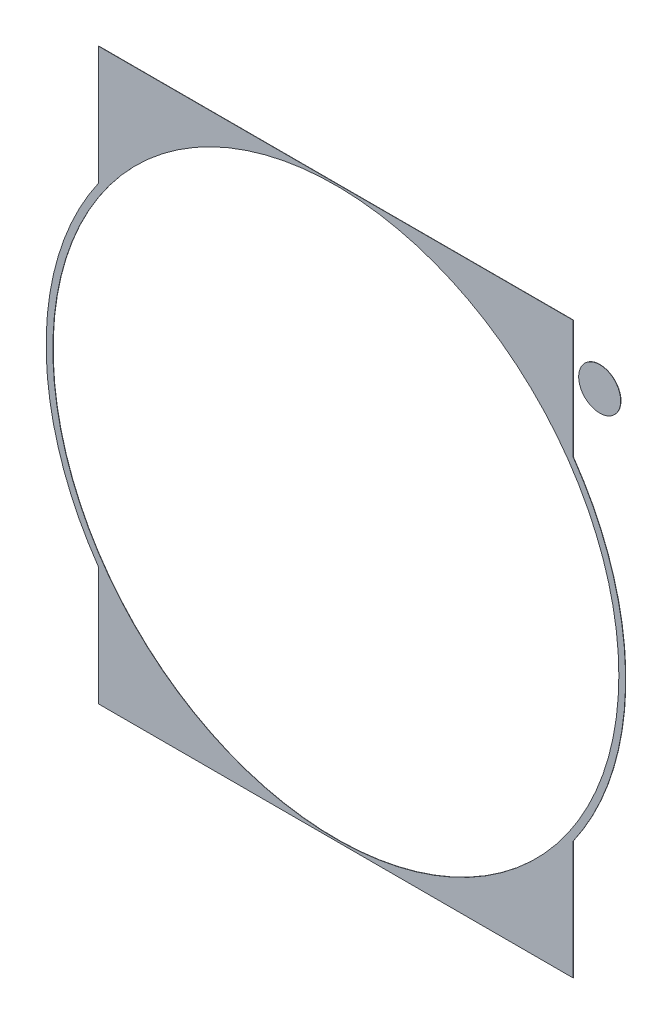
ISO-10303-21;
HEADER;
FILE_DESCRIPTION(('STEP AP214'),'2;1');
FILE_NAME('part.step','',(''),(''),'','','');
FILE_SCHEMA(('AUTOMOTIVE_DESIGN { 1 0 10303 214 1 1 1 1 }'));
ENDSEC;
DATA;
#1=APPLICATION_CONTEXT('core data for automotive mechanical design processes');
#2=APPLICATION_PROTOCOL_DEFINITION('international standard','automotive_design',2000,#1);
#3=PRODUCT_CONTEXT('',#1,'mechanical');
#4=PRODUCT('Part','Part','',(#3));
#5=PRODUCT_RELATED_PRODUCT_CATEGORY('part','',(#4));
#6=PRODUCT_DEFINITION_FORMATION('','',#4);
#7=PRODUCT_DEFINITION_CONTEXT('part definition',#1,'design');
#8=PRODUCT_DEFINITION('design','',#6,#7);
#9=PRODUCT_DEFINITION_SHAPE('','',#8);
#10=(LENGTH_UNIT() NAMED_UNIT(*) SI_UNIT(.MILLI.,.METRE.));
#11=(NAMED_UNIT(*) PLANE_ANGLE_UNIT() SI_UNIT($,.RADIAN.));
#12=(NAMED_UNIT(*) SI_UNIT($,.STERADIAN.) SOLID_ANGLE_UNIT());
#13=UNCERTAINTY_MEASURE_WITH_UNIT(LENGTH_MEASURE(1.E-05),#10,'distance_accuracy_value','');
#14=(GEOMETRIC_REPRESENTATION_CONTEXT(3) GLOBAL_UNCERTAINTY_ASSIGNED_CONTEXT((#13)) GLOBAL_UNIT_ASSIGNED_CONTEXT((#10,
#11,#12)) REPRESENTATION_CONTEXT('',''));
#15=CARTESIAN_POINT('',(0.,0.,0.));
#16=DIRECTION('',(0.,0.,1.));
#17=DIRECTION('',(1.,0.,0.));
#18=AXIS2_PLACEMENT_3D('',#15,#16,#17);
#19=CARTESIAN_POINT('',(12.49999934,6.49999934,0.942));
#20=DIRECTION('',(0.,0.,1.));
#21=DIRECTION('',(1.,0.,0.));
#22=AXIS2_PLACEMENT_3D('',#19,#20,#21);
#23=PLANE('',#22);
#24=CARTESIAN_POINT('',(12.49999934,6.49999934,0.942));
#25=DIRECTION('',(0.,0.,1.));
#26=DIRECTION('',(1.,0.,0.));
#27=AXIS2_PLACEMENT_3D('',#24,#25,#26);
#28=CIRCLE('',#27,2.980754502139);
#29=CARTESIAN_POINT('',(15.480753842139,6.49999934,0.942));
#30=VERTEX_POINT('',#29);
#31=EDGE_CURVE('P0_E129',#30,#30,#28,.T.);
#32=ORIENTED_EDGE('',*,*,#31,.T.);
#33=EDGE_LOOP('',(#32));
#34=FACE_BOUND('',#33,.T.);
#35=CARTESIAN_POINT('',(12.49999934,6.49999934,0.942));
#36=DIRECTION('',(0.,0.,1.));
#37=DIRECTION('',(1.,0.,0.));
#38=AXIS2_PLACEMENT_3D('',#35,#36,#37);
#39=CIRCLE('',#38,3.051770084655);
#40=CARTESIAN_POINT('',(14.9999994165049,4.74977070720069,0.942));
#41=VERTEX_POINT('',#40);
#42=CARTESIAN_POINT('',(14.9999992634951,8.25022819135623,0.942));
#43=VERTEX_POINT('',#42);
#44=EDGE_CURVE('P0_E135',#41,#43,#39,.T.);
#45=ORIENTED_EDGE('',*,*,#44,.F.);
#46=DIRECTION('',(-4.371138847178E-08,0.999999999999999,0.));
#47=VECTOR('',#46,1.);
#48=CARTESIAN_POINT('',(14.999999471134,3.499999449278,0.942));
#49=LINE('',#48,#47);
#50=CARTESIAN_POINT('',(14.999999471134,3.49999944927831,0.942));
#51=VERTEX_POINT('',#50);
#52=EDGE_CURVE('P0_E97',#51,#41,#49,.T.);
#53=ORIENTED_EDGE('',*,*,#52,.F.);
#54=DIRECTION('',(0.999999999999999,4.371138828674E-08,0.));
#55=VECTOR('',#54,1.);
#56=CARTESIAN_POINT('',(9.999999471134,3.499999230722,0.942));
#57=LINE('',#56,#55);
#58=CARTESIAN_POINT('',(9.99999947113408,3.499999230722,0.942));
#59=VERTEX_POINT('',#58);
#60=EDGE_CURVE('P0_E98',#59,#51,#57,.T.);
#61=ORIENTED_EDGE('',*,*,#60,.F.);
#62=DIRECTION('',(4.371138847178E-08,-0.999999999999999,0.));
#63=VECTOR('',#62,1.);
#64=CARTESIAN_POINT('',(9.999999416505,4.749770488644,0.942));
#65=LINE('',#64,#63);
#66=CARTESIAN_POINT('',(9.999999416505,4.74977048864382,0.942));
#67=VERTEX_POINT('',#66);
#68=EDGE_CURVE('P0_E94',#67,#59,#65,.T.);
#69=ORIENTED_EDGE('',*,*,#68,.F.);
#70=CARTESIAN_POINT('',(12.49999934,6.49999934,0.942));
#71=DIRECTION('',(0.,0.,1.));
#72=DIRECTION('',(1.,0.,0.));
#73=AXIS2_PLACEMENT_3D('',#70,#71,#72);
#74=CIRCLE('',#73,3.051770084655);
#75=CARTESIAN_POINT('',(9.99999926349507,8.25022797279931,0.942));
#76=VERTEX_POINT('',#75);
#77=EDGE_CURVE('P0_E20',#76,#67,#74,.T.);
#78=ORIENTED_EDGE('',*,*,#77,.F.);
#79=DIRECTION('',(4.371138847178E-08,-0.999999999999999,0.));
#80=VECTOR('',#79,1.);
#81=CARTESIAN_POINT('',(9.999999208866,9.499999230722,0.942));
#82=LINE('',#81,#80);
#83=CARTESIAN_POINT('',(9.999999208866,9.49999923072169,0.942));
#84=VERTEX_POINT('',#83);
#85=EDGE_CURVE('P0_E71',#84,#76,#82,.T.);
#86=ORIENTED_EDGE('',*,*,#85,.F.);
#87=DIRECTION('',(-0.999999999999999,-4.371138828674E-08,0.));
#88=VECTOR('',#87,1.);
#89=CARTESIAN_POINT('',(14.999999208866,9.499999449278,0.942));
#90=LINE('',#89,#88);
#91=CARTESIAN_POINT('',(14.9999992088659,9.499999449278,0.942));
#92=VERTEX_POINT('',#91);
#93=EDGE_CURVE('P0_E161',#92,#84,#90,.T.);
#94=ORIENTED_EDGE('',*,*,#93,.F.);
#95=DIRECTION('',(-4.371138847178E-08,0.999999999999999,0.));
#96=VECTOR('',#95,1.);
#97=CARTESIAN_POINT('',(14.999999263495,8.250228191356,0.942));
#98=LINE('',#97,#96);
#99=EDGE_CURVE('P0_E167',#43,#92,#98,.T.);
#100=ORIENTED_EDGE('',*,*,#99,.F.);
#101=EDGE_LOOP('',(#45,#53,#61,#69,#78,#86,#94,#100));
#102=FACE_BOUND('',#101,.T.);
#103=ADVANCED_FACE('P0_F17',(#34,#102),#23,.F.);
#104=CARTESIAN_POINT('',(14.999999263495,8.250228191356,0.942));
#105=DIRECTION('',(0.999999999999999,4.371138847178E-08,0.));
#106=DIRECTION('',(-4.371138847178E-08,0.999999999999999,0.));
#107=AXIS2_PLACEMENT_3D('',#104,#105,#106);
#108=PLANE('',#107);
#109=DIRECTION('',(0.,1.,0.));
#110=VECTOR('',#109,1.);
#111=CARTESIAN_POINT('',(14.999999263495,6.49999934,0.945));
#112=LINE('',#111,#110);
#113=CARTESIAN_POINT('',(14.9999992634951,8.25022819135623,0.945));
#114=VERTEX_POINT('',#113);
#115=CARTESIAN_POINT('',(14.9999992452853,9.499999449278,0.945));
#116=VERTEX_POINT('',#115);
#117=EDGE_CURVE('P0_E126',#114,#116,#112,.T.);
#118=ORIENTED_EDGE('',*,*,#117,.F.);
#119=DIRECTION('',(0.,0.,1.));
#120=VECTOR('',#119,1.);
#121=CARTESIAN_POINT('',(14.9999992634952,8.25022819135611,0.942));
#122=LINE('',#121,#120);
#123=EDGE_CURVE('P0_E132',#43,#114,#122,.T.);
#124=ORIENTED_EDGE('',*,*,#123,.F.);
#125=ORIENTED_EDGE('',*,*,#99,.T.);
#126=DIRECTION('',(0.,0.,1.));
#127=VECTOR('',#126,1.);
#128=CARTESIAN_POINT('',(14.999999208866,9.499999449278,0.942));
#129=LINE('',#128,#127);
#130=EDGE_CURVE('P0_E158',#116,#92,#129,.F.);
#131=ORIENTED_EDGE('',*,*,#130,.F.);
#132=EDGE_LOOP('',(#118,#124,#125,#131));
#133=FACE_BOUND('',#132,.T.);
#134=ADVANCED_FACE('P0_F194',(#133),#108,.T.);
#135=CARTESIAN_POINT('',(14.999999208866,9.499999449278,0.942));
#136=DIRECTION('',(-4.371138828674E-08,0.999999999999999,0.));
#137=DIRECTION('',(-0.999999999999999,-4.371138828674E-08,0.));
#138=AXIS2_PLACEMENT_3D('',#135,#136,#137);
#139=PLANE('',#138);
#140=DIRECTION('',(1.,0.,0.));
#141=VECTOR('',#140,1.);
#142=CARTESIAN_POINT('',(12.49999934,9.499999449278,0.945));
#143=LINE('',#142,#141);
#144=CARTESIAN_POINT('',(9.999999208866,9.499999376426,0.945));
#145=VERTEX_POINT('',#144);
#146=EDGE_CURVE('P0_E123',#116,#145,#143,.F.);
#147=ORIENTED_EDGE('',*,*,#146,.F.);
#148=ORIENTED_EDGE('',*,*,#130,.T.);
#149=ORIENTED_EDGE('',*,*,#93,.T.);
#150=DIRECTION('',(0.,0.,1.));
#151=VECTOR('',#150,1.);
#152=CARTESIAN_POINT('',(9.999999208866,9.499999230722,0.942));
#153=LINE('',#152,#151);
#154=EDGE_CURVE('P0_E149',#145,#84,#153,.F.);
#155=ORIENTED_EDGE('',*,*,#154,.F.);
#156=EDGE_LOOP('',(#147,#148,#149,#155));
#157=FACE_BOUND('',#156,.T.);
#158=ADVANCED_FACE('P0_F196',(#157),#139,.T.);
#159=CARTESIAN_POINT('',(9.999999208866,9.499999230722,0.942));
#160=DIRECTION('',(-0.999999999999999,-4.371138847178E-08,0.));
#161=DIRECTION('',(4.371138847178E-08,-0.999999999999999,0.));
#162=AXIS2_PLACEMENT_3D('',#159,#160,#161);
#163=PLANE('',#162);
#164=DIRECTION('',(0.,1.,0.));
#165=VECTOR('',#164,1.);
#166=CARTESIAN_POINT('',(9.999999208866,6.49999934,0.945));
#167=LINE('',#166,#165);
#168=CARTESIAN_POINT('',(9.99999923618045,8.25022793378352,0.945));
#169=VERTEX_POINT('',#168);
#170=EDGE_CURVE('P0_E114',#145,#169,#167,.F.);
#171=ORIENTED_EDGE('',*,*,#170,.F.);
#172=ORIENTED_EDGE('',*,*,#154,.T.);
#173=ORIENTED_EDGE('',*,*,#85,.T.);
#174=DIRECTION('',(0.,0.,1.));
#175=VECTOR('',#174,1.);
#176=CARTESIAN_POINT('',(9.9999992634949,8.25022797279907,0.942));
#177=LINE('',#176,#175);
#178=EDGE_CURVE('P0_E146',#169,#76,#177,.F.);
#179=ORIENTED_EDGE('',*,*,#178,.F.);
#180=EDGE_LOOP('',(#171,#172,#173,#179));
#181=FACE_BOUND('',#180,.T.);
#182=ADVANCED_FACE('P0_F199',(#181),#163,.T.);
#183=CARTESIAN_POINT('',(12.49999934,6.49999934,0.942));
#184=DIRECTION('',(0.,0.,1.));
#185=DIRECTION('',(1.,0.,0.));
#186=AXIS2_PLACEMENT_3D('',#183,#184,#185);
#187=CYLINDRICAL_SURFACE('',#186,3.051770084655);
#188=CARTESIAN_POINT('',(12.49999934,6.49999934,0.945));
#189=DIRECTION('',(0.,0.,1.));
#190=DIRECTION('',(1.,0.,0.));
#191=AXIS2_PLACEMENT_3D('',#188,#189,#190);
#192=CIRCLE('',#191,3.051770084655);
#193=CARTESIAN_POINT('',(9.999999416505,4.74977048864382,0.945));
#194=VERTEX_POINT('',#193);
#195=EDGE_CURVE('P0_E112',#169,#194,#192,.T.);
#196=ORIENTED_EDGE('',*,*,#195,.F.);
#197=ORIENTED_EDGE('',*,*,#178,.T.);
#198=ORIENTED_EDGE('',*,*,#77,.T.);
#199=DIRECTION('',(0.,0.,1.));
#200=VECTOR('',#199,1.);
#201=CARTESIAN_POINT('',(9.999999416505,4.749770488644,0.942));
#202=LINE('',#201,#200);
#203=EDGE_CURVE('P0_E144',#194,#67,#202,.F.);
#204=ORIENTED_EDGE('',*,*,#203,.F.);
#205=EDGE_LOOP('',(#196,#197,#198,#204));
#206=FACE_BOUND('',#205,.T.);
#207=ADVANCED_FACE('P0_F201',(#206),#187,.T.);
#208=CARTESIAN_POINT('',(9.999999416505,4.749770488644,0.942));
#209=DIRECTION('',(-0.999999999999999,-4.371138847178E-08,0.));
#210=DIRECTION('',(4.371138847178E-08,-0.999999999999999,0.));
#211=AXIS2_PLACEMENT_3D('',#208,#209,#210);
#212=PLANE('',#211);
#213=DIRECTION('',(0.,1.,0.));
#214=VECTOR('',#213,1.);
#215=CARTESIAN_POINT('',(9.999999416505,6.49999934,0.945));
#216=LINE('',#215,#214);
#217=CARTESIAN_POINT('',(9.99999943471467,3.499999230722,0.945));
#218=VERTEX_POINT('',#217);
#219=EDGE_CURVE('P0_E92',#194,#218,#216,.F.);
#220=ORIENTED_EDGE('',*,*,#219,.F.);
#221=ORIENTED_EDGE('',*,*,#203,.T.);
#222=ORIENTED_EDGE('',*,*,#68,.T.);
#223=DIRECTION('',(0.,0.,1.));
#224=VECTOR('',#223,1.);
#225=CARTESIAN_POINT('',(9.999999471134,3.499999230722,0.942));
#226=LINE('',#225,#224);
#227=EDGE_CURVE('P0_E87',#218,#59,#226,.F.);
#228=ORIENTED_EDGE('',*,*,#227,.F.);
#229=EDGE_LOOP('',(#220,#221,#222,#228));
#230=FACE_BOUND('',#229,.T.);
#231=ADVANCED_FACE('P0_F89',(#230),#212,.T.);
#232=CARTESIAN_POINT('',(9.999999471134,3.499999230722,0.942));
#233=DIRECTION('',(4.371138828674E-08,-0.999999999999999,0.));
#234=DIRECTION('',(0.999999999999999,4.371138828674E-08,0.));
#235=AXIS2_PLACEMENT_3D('',#232,#233,#234);
#236=PLANE('',#235);
#237=DIRECTION('',(1.,0.,0.));
#238=VECTOR('',#237,1.);
#239=CARTESIAN_POINT('',(12.49999934,3.499999230722,0.945));
#240=LINE('',#239,#238);
#241=CARTESIAN_POINT('',(14.999999471134,3.499999303574,0.945));
#242=VERTEX_POINT('',#241);
#243=EDGE_CURVE('P0_E101',#218,#242,#240,.T.);
#244=ORIENTED_EDGE('',*,*,#243,.F.);
#245=ORIENTED_EDGE('',*,*,#227,.T.);
#246=ORIENTED_EDGE('',*,*,#60,.T.);
#247=DIRECTION('',(0.,0.,1.));
#248=VECTOR('',#247,1.);
#249=CARTESIAN_POINT('',(14.999999471134,3.499999449278,0.942));
#250=LINE('',#249,#248);
#251=EDGE_CURVE('P0_E104',#242,#51,#250,.F.);
#252=ORIENTED_EDGE('',*,*,#251,.F.);
#253=EDGE_LOOP('',(#244,#245,#246,#252));
#254=FACE_BOUND('',#253,.T.);
#255=ADVANCED_FACE('P0_F102',(#254),#236,.T.);
#256=CARTESIAN_POINT('',(14.999999471134,3.499999449278,0.942));
#257=DIRECTION('',(0.999999999999999,4.371138847178E-08,0.));
#258=DIRECTION('',(-4.371138847178E-08,0.999999999999999,0.));
#259=AXIS2_PLACEMENT_3D('',#256,#257,#258);
#260=PLANE('',#259);
#261=DIRECTION('',(0.,1.,0.));
#262=VECTOR('',#261,1.);
#263=CARTESIAN_POINT('',(14.999999471134,6.49999934,0.945));
#264=LINE('',#263,#262);
#265=CARTESIAN_POINT('',(14.9999994438195,4.74977074621648,0.945));
#266=VERTEX_POINT('',#265);
#267=EDGE_CURVE('P0_E107',#242,#266,#264,.T.);
#268=ORIENTED_EDGE('',*,*,#267,.F.);
#269=ORIENTED_EDGE('',*,*,#251,.T.);
#270=ORIENTED_EDGE('',*,*,#52,.T.);
#271=DIRECTION('',(0.,0.,1.));
#272=VECTOR('',#271,1.);
#273=CARTESIAN_POINT('',(14.9999994165051,4.74977070720093,0.942));
#274=LINE('',#273,#272);
#275=EDGE_CURVE('P0_E35',#266,#41,#274,.F.);
#276=ORIENTED_EDGE('',*,*,#275,.F.);
#277=EDGE_LOOP('',(#268,#269,#270,#276));
#278=FACE_BOUND('',#277,.T.);
#279=ADVANCED_FACE('P0_F191',(#278),#260,.T.);
#280=CARTESIAN_POINT('',(12.49999934,6.49999934,0.942));
#281=DIRECTION('',(0.,0.,1.));
#282=DIRECTION('',(1.,0.,0.));
#283=AXIS2_PLACEMENT_3D('',#280,#281,#282);
#284=CYLINDRICAL_SURFACE('',#283,3.051770084655);
#285=CARTESIAN_POINT('',(12.49999934,6.49999934,0.945));
#286=DIRECTION('',(0.,0.,1.));
#287=DIRECTION('',(1.,0.,0.));
#288=AXIS2_PLACEMENT_3D('',#285,#286,#287);
#289=CIRCLE('',#288,3.051770084655);
#290=EDGE_CURVE('P0_E26',#266,#114,#289,.T.);
#291=ORIENTED_EDGE('',*,*,#290,.F.);
#292=ORIENTED_EDGE('',*,*,#275,.T.);
#293=ORIENTED_EDGE('',*,*,#44,.T.);
#294=ORIENTED_EDGE('',*,*,#123,.T.);
#295=EDGE_LOOP('',(#291,#292,#293,#294));
#296=FACE_BOUND('',#295,.T.);
#297=ADVANCED_FACE('P0_F189',(#296),#284,.T.);
#298=CARTESIAN_POINT('',(12.49999934,6.49999934,0.942));
#299=DIRECTION('',(0.,0.,1.));
#300=DIRECTION('',(1.,0.,0.));
#301=AXIS2_PLACEMENT_3D('',#298,#299,#300);
#302=CYLINDRICAL_SURFACE('',#301,2.980754502139);
#303=ORIENTED_EDGE('',*,*,#31,.F.);
#304=EDGE_LOOP('',(#303));
#305=FACE_BOUND('',#304,.T.);
#306=CARTESIAN_POINT('',(12.49999934,6.49999934,0.945));
#307=DIRECTION('',(0.,0.,1.));
#308=DIRECTION('',(1.,0.,0.));
#309=AXIS2_PLACEMENT_3D('',#306,#307,#308);
#310=CIRCLE('',#309,2.980754502139);
#311=CARTESIAN_POINT('',(15.480753842139,6.49999934,0.945));
#312=VERTEX_POINT('',#311);
#313=EDGE_CURVE('P0_E11',#312,#312,#310,.F.);
#314=ORIENTED_EDGE('',*,*,#313,.F.);
#315=EDGE_LOOP('',(#314));
#316=FACE_BOUND('',#315,.T.);
#317=ADVANCED_FACE('P0_F212',(#305,#316),#302,.F.);
#318=CARTESIAN_POINT('',(12.49999934,6.49999934,0.945));
#319=DIRECTION('',(0.,0.,1.));
#320=DIRECTION('',(1.,0.,0.));
#321=AXIS2_PLACEMENT_3D('',#318,#319,#320);
#322=PLANE('',#321);
#323=ORIENTED_EDGE('',*,*,#313,.T.);
#324=EDGE_LOOP('',(#323));
#325=FACE_BOUND('',#324,.T.);
#326=ORIENTED_EDGE('',*,*,#267,.T.);
#327=ORIENTED_EDGE('',*,*,#290,.T.);
#328=ORIENTED_EDGE('',*,*,#117,.T.);
#329=ORIENTED_EDGE('',*,*,#146,.T.);
#330=ORIENTED_EDGE('',*,*,#170,.T.);
#331=ORIENTED_EDGE('',*,*,#195,.T.);
#332=ORIENTED_EDGE('',*,*,#219,.T.);
#333=ORIENTED_EDGE('',*,*,#243,.T.);
#334=EDGE_LOOP('',(#326,#327,#328,#329,#330,#331,#332,#333));
#335=FACE_BOUND('',#334,.T.);
#336=ADVANCED_FACE('P0_F109',(#325,#335),#322,.T.);
#337=CLOSED_SHELL('',(#103,#134,#158,#182,#207,#231,#255,#279,#297,#317,#336));
#338=MANIFOLD_SOLID_BREP('P0_B1',#337);
#339=CARTESIAN_POINT('',(15.278994104691,9.013247881319,0.942));
#340=DIRECTION('',(0.,0.,1.));
#341=DIRECTION('',(1.,0.,0.));
#342=AXIS2_PLACEMENT_3D('',#339,#340,#341);
#343=PLANE('',#342);
#344=CARTESIAN_POINT('',(15.278994104691,9.013247881319,0.942));
#345=DIRECTION('',(0.,0.,1.));
#346=DIRECTION('',(1.,0.,0.));
#347=AXIS2_PLACEMENT_3D('',#344,#345,#346);
#348=CIRCLE('',#347,0.221317940426);
#349=CARTESIAN_POINT('',(15.500312045117,9.013247881319,0.942));
#350=VERTEX_POINT('',#349);
#351=EDGE_CURVE('P1_E18',#350,#350,#348,.T.);
#352=ORIENTED_EDGE('',*,*,#351,.F.);
#353=EDGE_LOOP('',(#352));
#354=FACE_BOUND('',#353,.T.);
#355=ADVANCED_FACE('P1_F15',(#354),#343,.F.);
#356=CARTESIAN_POINT('',(15.278994104691,9.013247881319,0.942));
#357=DIRECTION('',(0.,0.,1.));
#358=DIRECTION('',(1.,0.,0.));
#359=AXIS2_PLACEMENT_3D('',#356,#357,#358);
#360=CYLINDRICAL_SURFACE('',#359,0.221317940426);
#361=ORIENTED_EDGE('',*,*,#351,.T.);
#362=EDGE_LOOP('',(#361));
#363=FACE_BOUND('',#362,.T.);
#364=CARTESIAN_POINT('',(15.278994104691,9.013247881319,0.945));
#365=DIRECTION('',(0.,0.,1.));
#366=DIRECTION('',(1.,0.,0.));
#367=AXIS2_PLACEMENT_3D('',#364,#365,#366);
#368=CIRCLE('',#367,0.221317940426);
#369=CARTESIAN_POINT('',(15.500312045117,9.013247881319,0.945));
#370=VERTEX_POINT('',#369);
#371=EDGE_CURVE('P1_E10',#370,#370,#368,.T.);
#372=ORIENTED_EDGE('',*,*,#371,.F.);
#373=EDGE_LOOP('',(#372));
#374=FACE_BOUND('',#373,.T.);
#375=ADVANCED_FACE('P1_F27',(#363,#374),#360,.T.);
#376=CARTESIAN_POINT('',(15.278994104691,9.013247881319,0.945));
#377=DIRECTION('',(0.,0.,1.));
#378=DIRECTION('',(1.,0.,0.));
#379=AXIS2_PLACEMENT_3D('',#376,#377,#378);
#380=PLANE('',#379);
#381=ORIENTED_EDGE('',*,*,#371,.T.);
#382=EDGE_LOOP('',(#381));
#383=FACE_BOUND('',#382,.T.);
#384=ADVANCED_FACE('P1_F35',(#383),#380,.T.);
#385=CLOSED_SHELL('',(#355,#375,#384));
#386=MANIFOLD_SOLID_BREP('P1_B1',#385);
#387=ADVANCED_BREP_SHAPE_REPRESENTATION('',(#18,#338,#386),#14);
#388=SHAPE_DEFINITION_REPRESENTATION(#9,#387);
ENDSEC;
END-ISO-10303-21;
